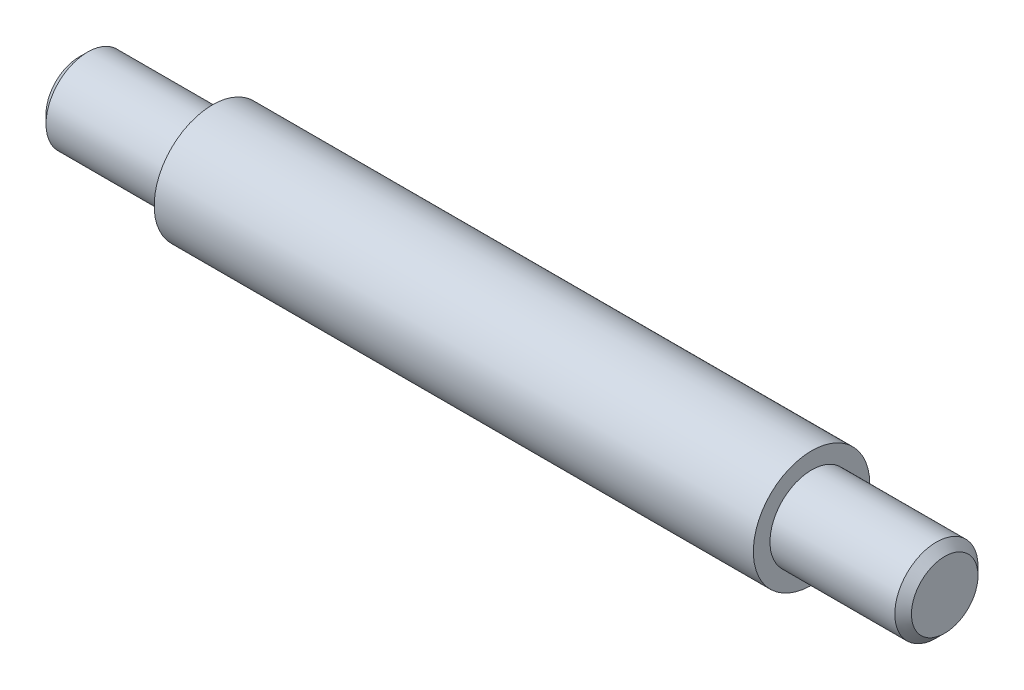
ISO-10303-21;
HEADER;
FILE_DESCRIPTION(('STEP AP214'),'2;1');
FILE_NAME('part.step','',(''),(''),'','','');
FILE_SCHEMA(('AUTOMOTIVE_DESIGN { 1 0 10303 214 1 1 1 1 }'));
ENDSEC;
DATA;
#1=APPLICATION_CONTEXT('core data for automotive mechanical design processes');
#2=APPLICATION_PROTOCOL_DEFINITION('international standard','automotive_design',2000,#1);
#3=PRODUCT_CONTEXT('',#1,'mechanical');
#4=PRODUCT('Part','Part','',(#3));
#5=PRODUCT_RELATED_PRODUCT_CATEGORY('part','',(#4));
#6=PRODUCT_DEFINITION_FORMATION('','',#4);
#7=PRODUCT_DEFINITION_CONTEXT('part definition',#1,'design');
#8=PRODUCT_DEFINITION('design','',#6,#7);
#9=PRODUCT_DEFINITION_SHAPE('','',#8);
#10=(LENGTH_UNIT() NAMED_UNIT(*) SI_UNIT(.MILLI.,.METRE.));
#11=(NAMED_UNIT(*) PLANE_ANGLE_UNIT() SI_UNIT($,.RADIAN.));
#12=(NAMED_UNIT(*) SI_UNIT($,.STERADIAN.) SOLID_ANGLE_UNIT());
#13=UNCERTAINTY_MEASURE_WITH_UNIT(LENGTH_MEASURE(1.E-05),#10,'distance_accuracy_value','');
#14=(GEOMETRIC_REPRESENTATION_CONTEXT(3) GLOBAL_UNCERTAINTY_ASSIGNED_CONTEXT((#13)) GLOBAL_UNIT_ASSIGNED_CONTEXT((#10,
#11,#12)) REPRESENTATION_CONTEXT('',''));
#15=CARTESIAN_POINT('',(0.,0.,0.));
#16=DIRECTION('',(0.,0.,1.));
#17=DIRECTION('',(1.,0.,0.));
#18=AXIS2_PLACEMENT_3D('',#15,#16,#17);
#19=CARTESIAN_POINT('',(-18.,0.,80.));
#20=DIRECTION('',(1.,0.,0.));
#21=DIRECTION('',(0.,0.,-1.));
#22=AXIS2_PLACEMENT_3D('',#19,#20,#21);
#23=PLANE('',#22);
#24=CARTESIAN_POINT('',(-18.,0.,80.));
#25=DIRECTION('',(1.,0.,0.));
#26=DIRECTION('',(0.,0.,-1.));
#27=AXIS2_PLACEMENT_3D('',#24,#25,#26);
#28=CIRCLE('',#27,3.50000000000001);
#29=CARTESIAN_POINT('',(-18.,0.,76.5));
#30=VERTEX_POINT('',#29);
#31=EDGE_CURVE('E55',#30,#30,#28,.T.);
#32=ORIENTED_EDGE('',*,*,#31,.F.);
#33=EDGE_LOOP('',(#32));
#34=FACE_BOUND('',#33,.T.);
#35=CARTESIAN_POINT('',(-18.,0.,80.));
#36=DIRECTION('',(1.,0.,0.));
#37=DIRECTION('',(0.,0.,-1.));
#38=AXIS2_PLACEMENT_3D('',#35,#36,#37);
#39=CIRCLE('',#38,2.50000000000001);
#40=CARTESIAN_POINT('',(-18.,0.,77.5));
#41=VERTEX_POINT('',#40);
#42=EDGE_CURVE('E51',#41,#41,#39,.F.);
#43=ORIENTED_EDGE('',*,*,#42,.F.);
#44=EDGE_LOOP('',(#43));
#45=FACE_BOUND('',#44,.T.);
#46=ADVANCED_FACE('F31',(#34,#45),#23,.F.);
#47=CARTESIAN_POINT('',(18.,0.,80.));
#48=DIRECTION('',(1.,0.,0.));
#49=DIRECTION('',(0.,0.,-1.));
#50=AXIS2_PLACEMENT_3D('',#47,#48,#49);
#51=PLANE('',#50);
#52=CARTESIAN_POINT('',(18.,0.,80.));
#53=DIRECTION('',(1.,0.,0.));
#54=DIRECTION('',(0.,0.,-1.));
#55=AXIS2_PLACEMENT_3D('',#52,#53,#54);
#56=CIRCLE('',#55,3.50000000000001);
#57=CARTESIAN_POINT('',(18.,0.,76.5));
#58=VERTEX_POINT('',#57);
#59=EDGE_CURVE('E54',#58,#58,#56,.T.);
#60=ORIENTED_EDGE('',*,*,#59,.T.);
#61=EDGE_LOOP('',(#60));
#62=FACE_BOUND('',#61,.T.);
#63=CARTESIAN_POINT('',(18.,0.,80.));
#64=DIRECTION('',(1.,0.,0.));
#65=DIRECTION('',(0.,0.,-1.));
#66=AXIS2_PLACEMENT_3D('',#63,#64,#65);
#67=CIRCLE('',#66,2.50000000000001);
#68=CARTESIAN_POINT('',(18.,0.,77.5));
#69=VERTEX_POINT('',#68);
#70=EDGE_CURVE('E58',#69,#69,#67,.T.);
#71=ORIENTED_EDGE('',*,*,#70,.F.);
#72=EDGE_LOOP('',(#71));
#73=FACE_BOUND('',#72,.T.);
#74=ADVANCED_FACE('F66',(#62,#73),#51,.T.);
#75=CARTESIAN_POINT('',(18.,0.,80.));
#76=DIRECTION('',(-1.,0.,0.));
#77=DIRECTION('',(0.,0.,1.));
#78=AXIS2_PLACEMENT_3D('',#75,#76,#77);
#79=CYLINDRICAL_SURFACE('',#78,3.50000000000001);
#80=ORIENTED_EDGE('',*,*,#59,.F.);
#81=EDGE_LOOP('',(#80));
#82=FACE_BOUND('',#81,.T.);
#83=ORIENTED_EDGE('',*,*,#31,.T.);
#84=EDGE_LOOP('',(#83));
#85=FACE_BOUND('',#84,.T.);
#86=ADVANCED_FACE('F68',(#82,#85),#79,.T.);
#87=CARTESIAN_POINT('',(26.,0.,80.));
#88=DIRECTION('',(-1.,0.,0.));
#89=DIRECTION('',(0.,0.,1.));
#90=AXIS2_PLACEMENT_3D('',#87,#88,#89);
#91=CYLINDRICAL_SURFACE('',#90,2.50000000000001);
#92=CARTESIAN_POINT('',(25.5,0.,80.));
#93=DIRECTION('',(1.,0.,0.));
#94=DIRECTION('',(0.,0.,-1.));
#95=AXIS2_PLACEMENT_3D('',#92,#93,#94);
#96=CIRCLE('',#95,2.50000000000001);
#97=CARTESIAN_POINT('',(25.5,0.,77.5));
#98=VERTEX_POINT('',#97);
#99=EDGE_CURVE('E10',#98,#98,#96,.F.);
#100=ORIENTED_EDGE('',*,*,#99,.T.);
#101=EDGE_LOOP('',(#100));
#102=FACE_BOUND('',#101,.T.);
#103=ORIENTED_EDGE('',*,*,#70,.T.);
#104=EDGE_LOOP('',(#103));
#105=FACE_BOUND('',#104,.T.);
#106=ADVANCED_FACE('F64',(#102,#105),#91,.T.);
#107=CARTESIAN_POINT('',(26.,0.,80.));
#108=DIRECTION('',(1.,0.,0.));
#109=DIRECTION('',(0.,0.,-1.));
#110=AXIS2_PLACEMENT_3D('',#107,#108,#109);
#111=PLANE('',#110);
#112=CARTESIAN_POINT('',(26.,0.,80.));
#113=DIRECTION('',(1.,0.,0.));
#114=DIRECTION('',(0.,0.,-1.));
#115=AXIS2_PLACEMENT_3D('',#112,#113,#114);
#116=CIRCLE('',#115,2.);
#117=CARTESIAN_POINT('',(26.,0.,78.));
#118=VERTEX_POINT('',#117);
#119=EDGE_CURVE('E38',#118,#118,#116,.T.);
#120=ORIENTED_EDGE('',*,*,#119,.T.);
#121=EDGE_LOOP('',(#120));
#122=FACE_BOUND('',#121,.T.);
#123=ADVANCED_FACE('F99',(#122),#111,.T.);
#124=CARTESIAN_POINT('',(-26.,0.,80.));
#125=DIRECTION('',(1.,0.,0.));
#126=DIRECTION('',(0.,0.,-1.));
#127=AXIS2_PLACEMENT_3D('',#124,#125,#126);
#128=CYLINDRICAL_SURFACE('',#127,2.50000000000001);
#129=CARTESIAN_POINT('',(-25.5,0.,80.));
#130=DIRECTION('',(-1.,0.,0.));
#131=DIRECTION('',(0.,0.,1.));
#132=AXIS2_PLACEMENT_3D('',#129,#130,#131);
#133=CIRCLE('',#132,2.50000000000001);
#134=CARTESIAN_POINT('',(-25.5,0.,82.5));
#135=VERTEX_POINT('',#134);
#136=EDGE_CURVE('E42',#135,#135,#133,.F.);
#137=ORIENTED_EDGE('',*,*,#136,.T.);
#138=EDGE_LOOP('',(#137));
#139=FACE_BOUND('',#138,.T.);
#140=ORIENTED_EDGE('',*,*,#42,.T.);
#141=EDGE_LOOP('',(#140));
#142=FACE_BOUND('',#141,.T.);
#143=ADVANCED_FACE('F90',(#139,#142),#128,.T.);
#144=CARTESIAN_POINT('',(-26.,0.,80.));
#145=DIRECTION('',(-1.,0.,0.));
#146=DIRECTION('',(0.,0.,1.));
#147=AXIS2_PLACEMENT_3D('',#144,#145,#146);
#148=PLANE('',#147);
#149=CARTESIAN_POINT('',(-26.,0.,80.));
#150=DIRECTION('',(-1.,0.,0.));
#151=DIRECTION('',(0.,0.,1.));
#152=AXIS2_PLACEMENT_3D('',#149,#150,#151);
#153=CIRCLE('',#152,2.);
#154=CARTESIAN_POINT('',(-26.,0.,82.));
#155=VERTEX_POINT('',#154);
#156=EDGE_CURVE('E46',#155,#155,#153,.T.);
#157=ORIENTED_EDGE('',*,*,#156,.T.);
#158=EDGE_LOOP('',(#157));
#159=FACE_BOUND('',#158,.T.);
#160=ADVANCED_FACE('F83',(#159),#148,.T.);
#161=CARTESIAN_POINT('',(-26.,0.,80.));
#162=DIRECTION('',(1.,0.,0.));
#163=DIRECTION('',(0.,0.,-1.));
#164=AXIS2_PLACEMENT_3D('',#161,#162,#163);
#165=CONICAL_SURFACE('',#164,2.,0.785398163397451);
#166=ORIENTED_EDGE('',*,*,#136,.F.);
#167=EDGE_LOOP('',(#166));
#168=FACE_BOUND('',#167,.T.);
#169=ORIENTED_EDGE('',*,*,#156,.F.);
#170=EDGE_LOOP('',(#169));
#171=FACE_BOUND('',#170,.T.);
#172=ADVANCED_FACE('F81',(#168,#171),#165,.T.);
#173=CARTESIAN_POINT('',(26.,0.,80.));
#174=DIRECTION('',(-1.,0.,0.));
#175=DIRECTION('',(0.,0.,1.));
#176=AXIS2_PLACEMENT_3D('',#173,#174,#175);
#177=CONICAL_SURFACE('',#176,2.,0.785398163397451);
#178=ORIENTED_EDGE('',*,*,#99,.F.);
#179=EDGE_LOOP('',(#178));
#180=FACE_BOUND('',#179,.T.);
#181=ORIENTED_EDGE('',*,*,#119,.F.);
#182=EDGE_LOOP('',(#181));
#183=FACE_BOUND('',#182,.T.);
#184=ADVANCED_FACE('F33',(#180,#183),#177,.T.);
#185=CLOSED_SHELL('',(#46,#74,#86,#106,#123,#143,#160,#172,#184));
#186=MANIFOLD_SOLID_BREP('B2',#185);
#187=ADVANCED_BREP_SHAPE_REPRESENTATION('',(#18,#186),#14);
#188=SHAPE_DEFINITION_REPRESENTATION(#9,#187);
ENDSEC;
END-ISO-10303-21;
